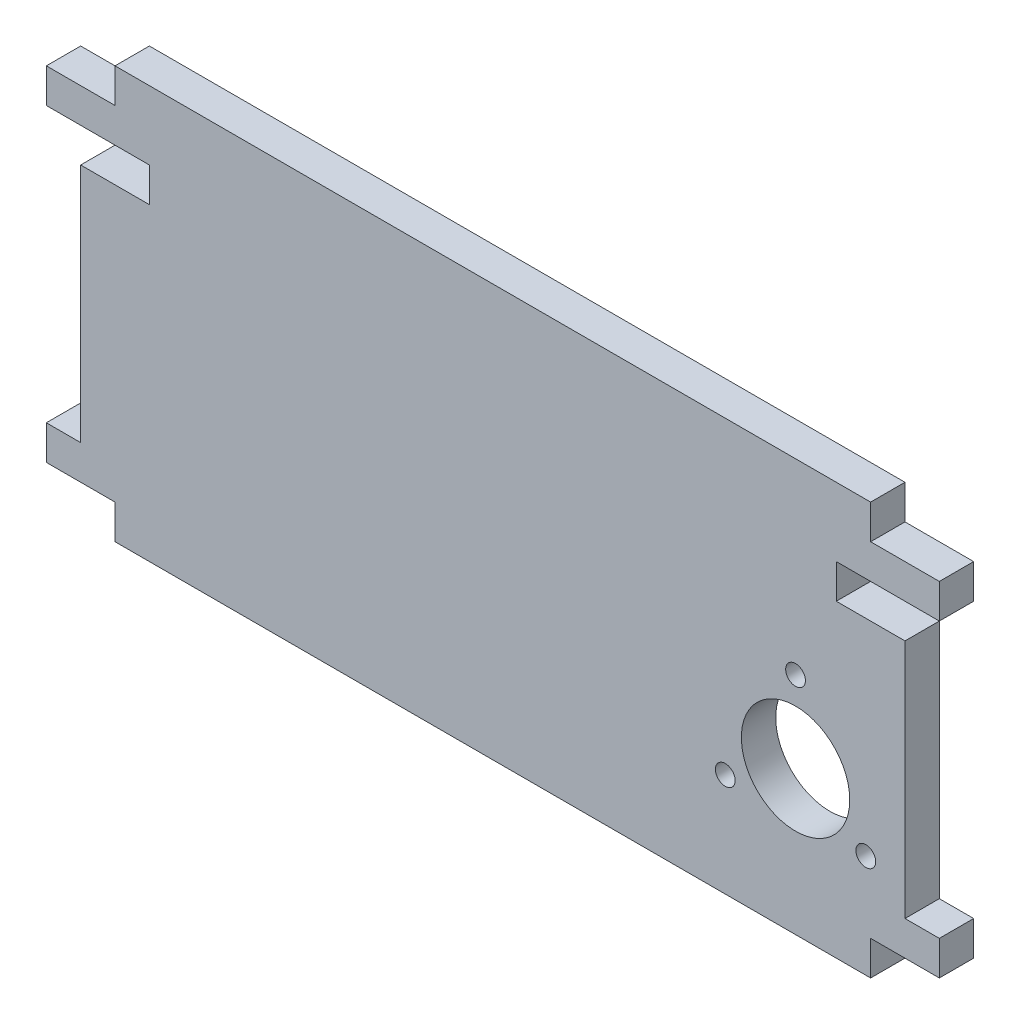
ISO-10303-21;
HEADER;
FILE_DESCRIPTION(('STEP AP214'),'2;1');
FILE_NAME('part.step','',(''),(''),'','','');
FILE_SCHEMA(('AUTOMOTIVE_DESIGN { 1 0 10303 214 1 1 1 1 }'));
ENDSEC;
DATA;
#1=APPLICATION_CONTEXT('core data for automotive mechanical design processes');
#2=APPLICATION_PROTOCOL_DEFINITION('international standard','automotive_design',2000,#1);
#3=PRODUCT_CONTEXT('',#1,'mechanical');
#4=PRODUCT('Part','Part','',(#3));
#5=PRODUCT_RELATED_PRODUCT_CATEGORY('part','',(#4));
#6=PRODUCT_DEFINITION_FORMATION('','',#4);
#7=PRODUCT_DEFINITION_CONTEXT('part definition',#1,'design');
#8=PRODUCT_DEFINITION('design','',#6,#7);
#9=PRODUCT_DEFINITION_SHAPE('','',#8);
#10=(LENGTH_UNIT() NAMED_UNIT(*) SI_UNIT(.MILLI.,.METRE.));
#11=(NAMED_UNIT(*) PLANE_ANGLE_UNIT() SI_UNIT($,.RADIAN.));
#12=(NAMED_UNIT(*) SI_UNIT($,.STERADIAN.) SOLID_ANGLE_UNIT());
#13=UNCERTAINTY_MEASURE_WITH_UNIT(LENGTH_MEASURE(1.E-05),#10,'distance_accuracy_value','');
#14=(GEOMETRIC_REPRESENTATION_CONTEXT(3) GLOBAL_UNCERTAINTY_ASSIGNED_CONTEXT((#13)) GLOBAL_UNIT_ASSIGNED_CONTEXT((#10,
#11,#12)) REPRESENTATION_CONTEXT('',''));
#15=CARTESIAN_POINT('',(0.,0.,0.));
#16=DIRECTION('',(0.,0.,1.));
#17=DIRECTION('',(1.,0.,0.));
#18=AXIS2_PLACEMENT_3D('',#15,#16,#17);
#19=CARTESIAN_POINT('',(0.,0.,0.));
#20=DIRECTION('',(0.,0.,1.));
#21=DIRECTION('',(1.,0.,0.));
#22=AXIS2_PLACEMENT_3D('',#19,#20,#21);
#23=PLANE('',#22);
#24=CARTESIAN_POINT('',(43.5592810567676,15.9061000000006,0.));
#25=DIRECTION('',(0.,0.,1.));
#26=DIRECTION('',(1.,0.,0.));
#27=AXIS2_PLACEMENT_3D('',#24,#25,#26);
#28=CIRCLE('',#27,1.8288);
#29=CARTESIAN_POINT('',(45.3880810567676,15.9061000000006,0.));
#30=VERTEX_POINT('',#29);
#31=EDGE_CURVE('E540',#30,#30,#28,.T.);
#32=ORIENTED_EDGE('',*,*,#31,.T.);
#33=EDGE_LOOP('',(#32));
#34=FACE_BOUND('',#33,.T.);
#35=CARTESIAN_POINT('',(17.5785189432344,15.9060999999994,0.));
#36=DIRECTION('',(0.,0.,1.));
#37=DIRECTION('',(1.,0.,0.));
#38=AXIS2_PLACEMENT_3D('',#35,#36,#37);
#39=CIRCLE('',#38,1.8288);
#40=CARTESIAN_POINT('',(19.4073189432344,15.9060999999994,0.));
#41=VERTEX_POINT('',#40);
#42=EDGE_CURVE('E536',#41,#41,#39,.T.);
#43=ORIENTED_EDGE('',*,*,#42,.T.);
#44=EDGE_LOOP('',(#43));
#45=FACE_BOUND('',#44,.T.);
#46=CARTESIAN_POINT('',(30.5689000000001,38.4061,0.));
#47=DIRECTION('',(0.,0.,1.));
#48=DIRECTION('',(1.,0.,0.));
#49=AXIS2_PLACEMENT_3D('',#46,#47,#48);
#50=CIRCLE('',#49,1.8288);
#51=CARTESIAN_POINT('',(32.3977000000001,38.4061,0.));
#52=VERTEX_POINT('',#51);
#53=EDGE_CURVE('E530',#52,#52,#50,.T.);
#54=ORIENTED_EDGE('',*,*,#53,.T.);
#55=EDGE_LOOP('',(#54));
#56=FACE_BOUND('',#55,.T.);
#57=CARTESIAN_POINT('',(30.5689000000001,23.4061,0.));
#58=DIRECTION('',(0.,0.,1.));
#59=DIRECTION('',(1.,0.,0.));
#60=AXIS2_PLACEMENT_3D('',#57,#58,#59);
#61=CIRCLE('',#60,10.0203);
#62=CARTESIAN_POINT('',(40.5892000000001,23.4061,0.));
#63=VERTEX_POINT('',#62);
#64=EDGE_CURVE('E225',#63,#63,#61,.T.);
#65=ORIENTED_EDGE('',*,*,#64,.T.);
#66=EDGE_LOOP('',(#65));
#67=FACE_BOUND('',#66,.T.);
#68=DIRECTION('',(0.,-1.,0.));
#69=VECTOR('',#68,1.);
#70=CARTESIAN_POINT('',(-101.6,60.325,0.));
#71=LINE('',#70,#69);
#72=CARTESIAN_POINT('',(-101.6,53.975,0.));
#73=VERTEX_POINT('',#72);
#74=CARTESIAN_POINT('',(-101.6,9.52500000000001,0.));
#75=VERTEX_POINT('',#74);
#76=EDGE_CURVE('E209',#73,#75,#71,.T.);
#77=ORIENTED_EDGE('',*,*,#76,.F.);
#78=DIRECTION('',(1.,0.,0.));
#79=VECTOR('',#78,1.);
#80=CARTESIAN_POINT('',(-107.95,53.975,0.));
#81=LINE('',#80,#79);
#82=CARTESIAN_POINT('',(-88.8999999999999,53.975,0.));
#83=VERTEX_POINT('',#82);
#84=EDGE_CURVE('E220',#73,#83,#81,.T.);
#85=ORIENTED_EDGE('',*,*,#84,.T.);
#86=DIRECTION('',(0.,1.,0.));
#87=VECTOR('',#86,1.);
#88=CARTESIAN_POINT('',(-88.8999999999999,53.975,0.));
#89=LINE('',#88,#87);
#90=CARTESIAN_POINT('',(-88.8999999999999,60.325,0.));
#91=VERTEX_POINT('',#90);
#92=EDGE_CURVE('E216',#83,#91,#89,.T.);
#93=ORIENTED_EDGE('',*,*,#92,.T.);
#94=DIRECTION('',(1.,0.,0.));
#95=VECTOR('',#94,1.);
#96=CARTESIAN_POINT('',(-107.95,60.325,0.));
#97=LINE('',#96,#95);
#98=CARTESIAN_POINT('',(-107.95,60.325,0.));
#99=VERTEX_POINT('',#98);
#100=EDGE_CURVE('E199',#99,#91,#97,.T.);
#101=ORIENTED_EDGE('',*,*,#100,.F.);
#102=DIRECTION('',(0.,-1.,0.));
#103=VECTOR('',#102,1.);
#104=CARTESIAN_POINT('',(-107.95,66.675,0.));
#105=LINE('',#104,#103);
#106=CARTESIAN_POINT('',(-107.95,66.675,0.));
#107=VERTEX_POINT('',#106);
#108=EDGE_CURVE('E210',#107,#99,#105,.T.);
#109=ORIENTED_EDGE('',*,*,#108,.F.);
#110=DIRECTION('',(-1.,0.,0.));
#111=VECTOR('',#110,1.);
#112=CARTESIAN_POINT('',(-95.2499999999999,66.675,0.));
#113=LINE('',#112,#111);
#114=CARTESIAN_POINT('',(-95.2499999999999,66.675,0.));
#115=VERTEX_POINT('',#114);
#116=EDGE_CURVE('E341',#115,#107,#113,.T.);
#117=ORIENTED_EDGE('',*,*,#116,.F.);
#118=DIRECTION('',(0.,-1.,0.));
#119=VECTOR('',#118,1.);
#120=CARTESIAN_POINT('',(-95.2499999999999,73.025,0.));
#121=LINE('',#120,#119);
#122=CARTESIAN_POINT('',(-95.2499999999999,73.025,0.));
#123=VERTEX_POINT('',#122);
#124=EDGE_CURVE('E338',#123,#115,#121,.T.);
#125=ORIENTED_EDGE('',*,*,#124,.F.);
#126=DIRECTION('',(-1.,0.,0.));
#127=VECTOR('',#126,1.);
#128=CARTESIAN_POINT('',(44.45,73.025,0.));
#129=LINE('',#128,#127);
#130=CARTESIAN_POINT('',(44.45,73.025,0.));
#131=VERTEX_POINT('',#130);
#132=EDGE_CURVE('E335',#131,#123,#129,.T.);
#133=ORIENTED_EDGE('',*,*,#132,.F.);
#134=DIRECTION('',(0.,1.,0.));
#135=VECTOR('',#134,1.);
#136=CARTESIAN_POINT('',(44.45,66.675,0.));
#137=LINE('',#136,#135);
#138=CARTESIAN_POINT('',(44.45,66.675,0.));
#139=VERTEX_POINT('',#138);
#140=EDGE_CURVE('E332',#139,#131,#137,.T.);
#141=ORIENTED_EDGE('',*,*,#140,.F.);
#142=DIRECTION('',(-1.,0.,0.));
#143=VECTOR('',#142,1.);
#144=CARTESIAN_POINT('',(57.15,66.675,0.));
#145=LINE('',#144,#143);
#146=CARTESIAN_POINT('',(57.15,66.675,0.));
#147=VERTEX_POINT('',#146);
#148=EDGE_CURVE('E329',#147,#139,#145,.T.);
#149=ORIENTED_EDGE('',*,*,#148,.F.);
#150=DIRECTION('',(0.,1.,0.));
#151=VECTOR('',#150,1.);
#152=CARTESIAN_POINT('',(57.15,60.325,0.));
#153=LINE('',#152,#151);
#154=CARTESIAN_POINT('',(57.15,60.325,0.));
#155=VERTEX_POINT('',#154);
#156=EDGE_CURVE('E326',#155,#147,#153,.T.);
#157=ORIENTED_EDGE('',*,*,#156,.F.);
#158=DIRECTION('',(1.,0.,0.));
#159=VECTOR('',#158,1.);
#160=CARTESIAN_POINT('',(50.8,60.325,0.));
#161=LINE('',#160,#159);
#162=CARTESIAN_POINT('',(38.1000000000001,60.325,0.));
#163=VERTEX_POINT('',#162);
#164=EDGE_CURVE('E323',#163,#155,#161,.T.);
#165=ORIENTED_EDGE('',*,*,#164,.F.);
#166=DIRECTION('',(0.,-1.,0.));
#167=VECTOR('',#166,1.);
#168=CARTESIAN_POINT('',(38.1000000000001,60.325,0.));
#169=LINE('',#168,#167);
#170=CARTESIAN_POINT('',(38.1000000000001,53.975,0.));
#171=VERTEX_POINT('',#170);
#172=EDGE_CURVE('E236',#163,#171,#169,.T.);
#173=ORIENTED_EDGE('',*,*,#172,.T.);
#174=DIRECTION('',(1.,0.,0.));
#175=VECTOR('',#174,1.);
#176=CARTESIAN_POINT('',(38.1000000000001,53.975,0.));
#177=LINE('',#176,#175);
#178=CARTESIAN_POINT('',(50.8,53.975,0.));
#179=VERTEX_POINT('',#178);
#180=EDGE_CURVE('E239',#171,#179,#177,.T.);
#181=ORIENTED_EDGE('',*,*,#180,.T.);
#182=DIRECTION('',(0.,1.,0.));
#183=VECTOR('',#182,1.);
#184=CARTESIAN_POINT('',(50.8,9.52500000000001,0.));
#185=LINE('',#184,#183);
#186=CARTESIAN_POINT('',(50.8,9.52500000000001,0.));
#187=VERTEX_POINT('',#186);
#188=EDGE_CURVE('E320',#187,#179,#185,.T.);
#189=ORIENTED_EDGE('',*,*,#188,.F.);
#190=DIRECTION('',(-1.,0.,0.));
#191=VECTOR('',#190,1.);
#192=CARTESIAN_POINT('',(57.15,9.52500000000001,0.));
#193=LINE('',#192,#191);
#194=CARTESIAN_POINT('',(57.15,9.52500000000001,0.));
#195=VERTEX_POINT('',#194);
#196=EDGE_CURVE('E317',#195,#187,#193,.T.);
#197=ORIENTED_EDGE('',*,*,#196,.F.);
#198=DIRECTION('',(0.,1.,0.));
#199=VECTOR('',#198,1.);
#200=CARTESIAN_POINT('',(57.15,3.175,0.));
#201=LINE('',#200,#199);
#202=CARTESIAN_POINT('',(57.15,3.175,0.));
#203=VERTEX_POINT('',#202);
#204=EDGE_CURVE('E314',#203,#195,#201,.T.);
#205=ORIENTED_EDGE('',*,*,#204,.F.);
#206=DIRECTION('',(1.,0.,0.));
#207=VECTOR('',#206,1.);
#208=CARTESIAN_POINT('',(44.45,3.175,0.));
#209=LINE('',#208,#207);
#210=CARTESIAN_POINT('',(44.45,3.175,0.));
#211=VERTEX_POINT('',#210);
#212=EDGE_CURVE('E311',#211,#203,#209,.T.);
#213=ORIENTED_EDGE('',*,*,#212,.F.);
#214=DIRECTION('',(0.,1.,0.));
#215=VECTOR('',#214,1.);
#216=CARTESIAN_POINT('',(44.45,-3.175,0.));
#217=LINE('',#216,#215);
#218=CARTESIAN_POINT('',(44.45,-3.175,0.));
#219=VERTEX_POINT('',#218);
#220=EDGE_CURVE('E308',#219,#211,#217,.T.);
#221=ORIENTED_EDGE('',*,*,#220,.F.);
#222=DIRECTION('',(1.,0.,0.));
#223=VECTOR('',#222,1.);
#224=CARTESIAN_POINT('',(-95.2499999999999,-3.175,0.));
#225=LINE('',#224,#223);
#226=CARTESIAN_POINT('',(-95.2499999999999,-3.175,0.));
#227=VERTEX_POINT('',#226);
#228=EDGE_CURVE('E305',#227,#219,#225,.T.);
#229=ORIENTED_EDGE('',*,*,#228,.F.);
#230=DIRECTION('',(0.,-1.,0.));
#231=VECTOR('',#230,1.);
#232=CARTESIAN_POINT('',(-95.2499999999999,3.175,0.));
#233=LINE('',#232,#231);
#234=CARTESIAN_POINT('',(-95.2499999999999,3.175,0.));
#235=VERTEX_POINT('',#234);
#236=EDGE_CURVE('E254',#235,#227,#233,.T.);
#237=ORIENTED_EDGE('',*,*,#236,.F.);
#238=DIRECTION('',(1.,0.,0.));
#239=VECTOR('',#238,1.);
#240=CARTESIAN_POINT('',(-107.95,3.175,0.));
#241=LINE('',#240,#239);
#242=CARTESIAN_POINT('',(-107.95,3.175,0.));
#243=VERTEX_POINT('',#242);
#244=EDGE_CURVE('E352',#243,#235,#241,.T.);
#245=ORIENTED_EDGE('',*,*,#244,.F.);
#246=DIRECTION('',(0.,-1.,0.));
#247=VECTOR('',#246,1.);
#248=CARTESIAN_POINT('',(-107.95,9.52500000000001,0.));
#249=LINE('',#248,#247);
#250=CARTESIAN_POINT('',(-107.95,9.52500000000001,0.));
#251=VERTEX_POINT('',#250);
#252=EDGE_CURVE('E349',#251,#243,#249,.T.);
#253=ORIENTED_EDGE('',*,*,#252,.F.);
#254=DIRECTION('',(-1.,0.,0.));
#255=VECTOR('',#254,1.);
#256=CARTESIAN_POINT('',(-101.6,9.52500000000001,0.));
#257=LINE('',#256,#255);
#258=EDGE_CURVE('E346',#75,#251,#257,.T.);
#259=ORIENTED_EDGE('',*,*,#258,.F.);
#260=EDGE_LOOP('',(#77,#85,#93,#101,#109,#117,#125,#133,#141,#149,#157,#165,#173,#181,#189,#197,
#205,#213,#221,#229,#237,#245,#253,#259));
#261=FACE_BOUND('',#260,.T.);
#262=ADVANCED_FACE('F33',(#34,#45,#56,#67,#261),#23,.F.);
#263=CARTESIAN_POINT('',(-107.95,3.175,188.18632750361));
#264=DIRECTION('',(0.,1.,0.));
#265=DIRECTION('',(0.,0.,1.));
#266=AXIS2_PLACEMENT_3D('',#263,#264,#265);
#267=PLANE('',#266);
#268=DIRECTION('',(0.,0.,-1.));
#269=VECTOR('',#268,1.);
#270=CARTESIAN_POINT('',(-95.2499999999999,3.175,188.18632750361));
#271=LINE('',#270,#269);
#272=CARTESIAN_POINT('',(-95.2499999999999,3.175,6.34999999999999));
#273=VERTEX_POINT('',#272);
#274=EDGE_CURVE('E355',#273,#235,#271,.T.);
#275=ORIENTED_EDGE('',*,*,#274,.F.);
#276=DIRECTION('',(-1.,0.,0.));
#277=VECTOR('',#276,1.);
#278=CARTESIAN_POINT('',(-107.95,3.175,6.34999999999999));
#279=LINE('',#278,#277);
#280=CARTESIAN_POINT('',(-107.95,3.175,6.34999999999999));
#281=VERTEX_POINT('',#280);
#282=EDGE_CURVE('E258',#273,#281,#279,.T.);
#283=ORIENTED_EDGE('',*,*,#282,.T.);
#284=DIRECTION('',(0.,0.,-1.));
#285=VECTOR('',#284,1.);
#286=CARTESIAN_POINT('',(-107.95,3.175,188.18632750361));
#287=LINE('',#286,#285);
#288=EDGE_CURVE('E357',#281,#243,#287,.T.);
#289=ORIENTED_EDGE('',*,*,#288,.T.);
#290=ORIENTED_EDGE('',*,*,#244,.T.);
#291=EDGE_LOOP('',(#275,#283,#289,#290));
#292=FACE_BOUND('',#291,.T.);
#293=ADVANCED_FACE('F393',(#292),#267,.F.);
#294=CARTESIAN_POINT('',(-107.95,9.52500000000001,188.18632750361));
#295=DIRECTION('',(1.,0.,0.));
#296=DIRECTION('',(0.,0.,-1.));
#297=AXIS2_PLACEMENT_3D('',#294,#295,#296);
#298=PLANE('',#297);
#299=ORIENTED_EDGE('',*,*,#288,.F.);
#300=DIRECTION('',(0.,1.,0.));
#301=VECTOR('',#300,1.);
#302=CARTESIAN_POINT('',(-107.95,9.52500000000001,6.34999999999999));
#303=LINE('',#302,#301);
#304=CARTESIAN_POINT('',(-107.95,9.52500000000001,6.34999999999999));
#305=VERTEX_POINT('',#304);
#306=EDGE_CURVE('E255',#281,#305,#303,.T.);
#307=ORIENTED_EDGE('',*,*,#306,.T.);
#308=DIRECTION('',(0.,0.,-1.));
#309=VECTOR('',#308,1.);
#310=CARTESIAN_POINT('',(-107.95,9.52500000000001,188.18632750361));
#311=LINE('',#310,#309);
#312=EDGE_CURVE('E359',#305,#251,#311,.T.);
#313=ORIENTED_EDGE('',*,*,#312,.T.);
#314=ORIENTED_EDGE('',*,*,#252,.T.);
#315=EDGE_LOOP('',(#299,#307,#313,#314));
#316=FACE_BOUND('',#315,.T.);
#317=ADVANCED_FACE('F475',(#316),#298,.F.);
#318=CARTESIAN_POINT('',(-101.6,9.52500000000001,188.18632750361));
#319=DIRECTION('',(0.,-1.,0.));
#320=DIRECTION('',(0.,0.,-1.));
#321=AXIS2_PLACEMENT_3D('',#318,#319,#320);
#322=PLANE('',#321);
#323=ORIENTED_EDGE('',*,*,#312,.F.);
#324=DIRECTION('',(1.,0.,0.));
#325=VECTOR('',#324,1.);
#326=CARTESIAN_POINT('',(-101.6,9.52500000000001,6.34999999999999));
#327=LINE('',#326,#325);
#328=CARTESIAN_POINT('',(-101.6,9.52500000000001,6.34999999999999));
#329=VERTEX_POINT('',#328);
#330=EDGE_CURVE('E56',#305,#329,#327,.T.);
#331=ORIENTED_EDGE('',*,*,#330,.T.);
#332=DIRECTION('',(0.,0.,-1.));
#333=VECTOR('',#332,1.);
#334=CARTESIAN_POINT('',(-101.6,9.52500000000001,188.18632750361));
#335=LINE('',#334,#333);
#336=EDGE_CURVE('E361',#329,#75,#335,.T.);
#337=ORIENTED_EDGE('',*,*,#336,.T.);
#338=ORIENTED_EDGE('',*,*,#258,.T.);
#339=EDGE_LOOP('',(#323,#331,#337,#338));
#340=FACE_BOUND('',#339,.T.);
#341=ADVANCED_FACE('F484',(#340),#322,.F.);
#342=CARTESIAN_POINT('',(-101.6,60.325,188.18632750361));
#343=DIRECTION('',(1.,0.,0.));
#344=DIRECTION('',(0.,0.,-1.));
#345=AXIS2_PLACEMENT_3D('',#342,#343,#344);
#346=PLANE('',#345);
#347=DIRECTION('',(0.,1.,0.));
#348=VECTOR('',#347,1.);
#349=CARTESIAN_POINT('',(-101.6,60.325,6.34999999999999));
#350=LINE('',#349,#348);
#351=CARTESIAN_POINT('',(-101.6,53.975,6.35));
#352=VERTEX_POINT('',#351);
#353=EDGE_CURVE('E260',#329,#352,#350,.T.);
#354=ORIENTED_EDGE('',*,*,#353,.T.);
#355=DIRECTION('',(0.,0.,-1.));
#356=VECTOR('',#355,1.);
#357=CARTESIAN_POINT('',(-101.6,53.975,188.18632750361));
#358=LINE('',#357,#356);
#359=EDGE_CURVE('E231',#352,#73,#358,.T.);
#360=ORIENTED_EDGE('',*,*,#359,.T.);
#361=ORIENTED_EDGE('',*,*,#76,.T.);
#362=ORIENTED_EDGE('',*,*,#336,.F.);
#363=EDGE_LOOP('',(#354,#360,#361,#362));
#364=FACE_BOUND('',#363,.T.);
#365=ADVANCED_FACE('F467',(#364),#346,.F.);
#366=CARTESIAN_POINT('',(-107.95,60.325,188.18632750361));
#367=DIRECTION('',(0.,1.,0.));
#368=DIRECTION('',(0.,0.,1.));
#369=AXIS2_PLACEMENT_3D('',#366,#367,#368);
#370=PLANE('',#369);
#371=ORIENTED_EDGE('',*,*,#100,.T.);
#372=DIRECTION('',(0.,0.,1.));
#373=VECTOR('',#372,1.);
#374=CARTESIAN_POINT('',(-88.8999999999999,60.325,0.));
#375=LINE('',#374,#373);
#376=CARTESIAN_POINT('',(-88.8999999999999,60.325,6.35));
#377=VERTEX_POINT('',#376);
#378=EDGE_CURVE('E202',#91,#377,#375,.T.);
#379=ORIENTED_EDGE('',*,*,#378,.T.);
#380=DIRECTION('',(-1.,0.,0.));
#381=VECTOR('',#380,1.);
#382=CARTESIAN_POINT('',(-107.95,60.325,6.34999999999999));
#383=LINE('',#382,#381);
#384=CARTESIAN_POINT('',(-107.95,60.325,6.34999999999999));
#385=VERTEX_POINT('',#384);
#386=EDGE_CURVE('E48',#377,#385,#383,.T.);
#387=ORIENTED_EDGE('',*,*,#386,.T.);
#388=DIRECTION('',(0.,0.,-1.));
#389=VECTOR('',#388,1.);
#390=CARTESIAN_POINT('',(-107.95,60.325,188.18632750361));
#391=LINE('',#390,#389);
#392=EDGE_CURVE('E204',#385,#99,#391,.T.);
#393=ORIENTED_EDGE('',*,*,#392,.T.);
#394=EDGE_LOOP('',(#371,#379,#387,#393));
#395=FACE_BOUND('',#394,.T.);
#396=ADVANCED_FACE('F201',(#395),#370,.F.);
#397=CARTESIAN_POINT('',(-107.95,66.675,188.18632750361));
#398=DIRECTION('',(1.,0.,0.));
#399=DIRECTION('',(0.,0.,-1.));
#400=AXIS2_PLACEMENT_3D('',#397,#398,#399);
#401=PLANE('',#400);
#402=ORIENTED_EDGE('',*,*,#392,.F.);
#403=DIRECTION('',(0.,1.,0.));
#404=VECTOR('',#403,1.);
#405=CARTESIAN_POINT('',(-107.95,66.675,6.34999999999999));
#406=LINE('',#405,#404);
#407=CARTESIAN_POINT('',(-107.95,66.675,6.34999999999999));
#408=VERTEX_POINT('',#407);
#409=EDGE_CURVE('E264',#385,#408,#406,.T.);
#410=ORIENTED_EDGE('',*,*,#409,.T.);
#411=DIRECTION('',(0.,0.,-1.));
#412=VECTOR('',#411,1.);
#413=CARTESIAN_POINT('',(-107.95,66.675,188.18632750361));
#414=LINE('',#413,#412);
#415=EDGE_CURVE('E365',#408,#107,#414,.T.);
#416=ORIENTED_EDGE('',*,*,#415,.T.);
#417=ORIENTED_EDGE('',*,*,#108,.T.);
#418=EDGE_LOOP('',(#402,#410,#416,#417));
#419=FACE_BOUND('',#418,.T.);
#420=ADVANCED_FACE('F459',(#419),#401,.F.);
#421=CARTESIAN_POINT('',(-95.2499999999999,66.675,188.18632750361));
#422=DIRECTION('',(0.,-1.,0.));
#423=DIRECTION('',(0.,0.,-1.));
#424=AXIS2_PLACEMENT_3D('',#421,#422,#423);
#425=PLANE('',#424);
#426=ORIENTED_EDGE('',*,*,#415,.F.);
#427=DIRECTION('',(1.,0.,0.));
#428=VECTOR('',#427,1.);
#429=CARTESIAN_POINT('',(-95.2499999999999,66.675,6.34999999999999));
#430=LINE('',#429,#428);
#431=CARTESIAN_POINT('',(-95.2499999999999,66.675,6.34999999999999));
#432=VERTEX_POINT('',#431);
#433=EDGE_CURVE('E267',#408,#432,#430,.T.);
#434=ORIENTED_EDGE('',*,*,#433,.T.);
#435=DIRECTION('',(0.,0.,-1.));
#436=VECTOR('',#435,1.);
#437=CARTESIAN_POINT('',(-95.2499999999999,66.675,188.18632750361));
#438=LINE('',#437,#436);
#439=EDGE_CURVE('E367',#432,#115,#438,.T.);
#440=ORIENTED_EDGE('',*,*,#439,.T.);
#441=ORIENTED_EDGE('',*,*,#116,.T.);
#442=EDGE_LOOP('',(#426,#434,#440,#441));
#443=FACE_BOUND('',#442,.T.);
#444=ADVANCED_FACE('F456',(#443),#425,.F.);
#445=CARTESIAN_POINT('',(-95.2499999999999,73.025,188.18632750361));
#446=DIRECTION('',(1.,0.,0.));
#447=DIRECTION('',(0.,0.,-1.));
#448=AXIS2_PLACEMENT_3D('',#445,#446,#447);
#449=PLANE('',#448);
#450=ORIENTED_EDGE('',*,*,#439,.F.);
#451=DIRECTION('',(0.,1.,0.));
#452=VECTOR('',#451,1.);
#453=CARTESIAN_POINT('',(-95.2499999999999,73.025,6.34999999999999));
#454=LINE('',#453,#452);
#455=CARTESIAN_POINT('',(-95.2499999999999,73.025,6.34999999999999));
#456=VERTEX_POINT('',#455);
#457=EDGE_CURVE('E270',#432,#456,#454,.T.);
#458=ORIENTED_EDGE('',*,*,#457,.T.);
#459=DIRECTION('',(0.,0.,-1.));
#460=VECTOR('',#459,1.);
#461=CARTESIAN_POINT('',(-95.2499999999999,73.025,188.18632750361));
#462=LINE('',#461,#460);
#463=EDGE_CURVE('E369',#456,#123,#462,.T.);
#464=ORIENTED_EDGE('',*,*,#463,.T.);
#465=ORIENTED_EDGE('',*,*,#124,.T.);
#466=EDGE_LOOP('',(#450,#458,#464,#465));
#467=FACE_BOUND('',#466,.T.);
#468=ADVANCED_FACE('F453',(#467),#449,.F.);
#469=CARTESIAN_POINT('',(44.45,73.025,188.18632750361));
#470=DIRECTION('',(0.,-1.,0.));
#471=DIRECTION('',(0.,0.,-1.));
#472=AXIS2_PLACEMENT_3D('',#469,#470,#471);
#473=PLANE('',#472);
#474=ORIENTED_EDGE('',*,*,#463,.F.);
#475=DIRECTION('',(1.,0.,0.));
#476=VECTOR('',#475,1.);
#477=CARTESIAN_POINT('',(44.45,73.025,6.34999999999999));
#478=LINE('',#477,#476);
#479=CARTESIAN_POINT('',(44.45,73.025,6.34999999999999));
#480=VERTEX_POINT('',#479);
#481=EDGE_CURVE('E273',#456,#480,#478,.T.);
#482=ORIENTED_EDGE('',*,*,#481,.T.);
#483=DIRECTION('',(0.,0.,-1.));
#484=VECTOR('',#483,1.);
#485=CARTESIAN_POINT('',(44.45,73.025,188.18632750361));
#486=LINE('',#485,#484);
#487=EDGE_CURVE('E371',#480,#131,#486,.T.);
#488=ORIENTED_EDGE('',*,*,#487,.T.);
#489=ORIENTED_EDGE('',*,*,#132,.T.);
#490=EDGE_LOOP('',(#474,#482,#488,#489));
#491=FACE_BOUND('',#490,.T.);
#492=ADVANCED_FACE('F449',(#491),#473,.F.);
#493=CARTESIAN_POINT('',(44.45,66.675,188.18632750361));
#494=DIRECTION('',(-1.,0.,0.));
#495=DIRECTION('',(0.,0.,1.));
#496=AXIS2_PLACEMENT_3D('',#493,#494,#495);
#497=PLANE('',#496);
#498=ORIENTED_EDGE('',*,*,#487,.F.);
#499=DIRECTION('',(0.,-1.,0.));
#500=VECTOR('',#499,1.);
#501=CARTESIAN_POINT('',(44.45,66.675,6.34999999999999));
#502=LINE('',#501,#500);
#503=CARTESIAN_POINT('',(44.45,66.675,6.34999999999999));
#504=VERTEX_POINT('',#503);
#505=EDGE_CURVE('E276',#480,#504,#502,.T.);
#506=ORIENTED_EDGE('',*,*,#505,.T.);
#507=DIRECTION('',(0.,0.,-1.));
#508=VECTOR('',#507,1.);
#509=CARTESIAN_POINT('',(44.45,66.675,188.18632750361));
#510=LINE('',#509,#508);
#511=EDGE_CURVE('E373',#504,#139,#510,.T.);
#512=ORIENTED_EDGE('',*,*,#511,.T.);
#513=ORIENTED_EDGE('',*,*,#140,.T.);
#514=EDGE_LOOP('',(#498,#506,#512,#513));
#515=FACE_BOUND('',#514,.T.);
#516=ADVANCED_FACE('F445',(#515),#497,.F.);
#517=CARTESIAN_POINT('',(57.15,66.675,188.18632750361));
#518=DIRECTION('',(0.,-1.,0.));
#519=DIRECTION('',(0.,0.,-1.));
#520=AXIS2_PLACEMENT_3D('',#517,#518,#519);
#521=PLANE('',#520);
#522=ORIENTED_EDGE('',*,*,#511,.F.);
#523=DIRECTION('',(1.,0.,0.));
#524=VECTOR('',#523,1.);
#525=CARTESIAN_POINT('',(57.15,66.675,6.34999999999999));
#526=LINE('',#525,#524);
#527=CARTESIAN_POINT('',(57.15,66.675,6.34999999999999));
#528=VERTEX_POINT('',#527);
#529=EDGE_CURVE('E279',#504,#528,#526,.T.);
#530=ORIENTED_EDGE('',*,*,#529,.T.);
#531=DIRECTION('',(0.,0.,-1.));
#532=VECTOR('',#531,1.);
#533=CARTESIAN_POINT('',(57.15,66.675,188.18632750361));
#534=LINE('',#533,#532);
#535=EDGE_CURVE('E375',#528,#147,#534,.T.);
#536=ORIENTED_EDGE('',*,*,#535,.T.);
#537=ORIENTED_EDGE('',*,*,#148,.T.);
#538=EDGE_LOOP('',(#522,#530,#536,#537));
#539=FACE_BOUND('',#538,.T.);
#540=ADVANCED_FACE('F441',(#539),#521,.F.);
#541=CARTESIAN_POINT('',(57.15,60.325,188.18632750361));
#542=DIRECTION('',(-1.,0.,0.));
#543=DIRECTION('',(0.,0.,1.));
#544=AXIS2_PLACEMENT_3D('',#541,#542,#543);
#545=PLANE('',#544);
#546=ORIENTED_EDGE('',*,*,#535,.F.);
#547=DIRECTION('',(0.,-1.,0.));
#548=VECTOR('',#547,1.);
#549=CARTESIAN_POINT('',(57.15,60.325,6.34999999999999));
#550=LINE('',#549,#548);
#551=CARTESIAN_POINT('',(57.15,60.325,6.34999999999999));
#552=VERTEX_POINT('',#551);
#553=EDGE_CURVE('E282',#528,#552,#550,.T.);
#554=ORIENTED_EDGE('',*,*,#553,.T.);
#555=DIRECTION('',(0.,0.,-1.));
#556=VECTOR('',#555,1.);
#557=CARTESIAN_POINT('',(57.15,60.325,188.18632750361));
#558=LINE('',#557,#556);
#559=EDGE_CURVE('E377',#552,#155,#558,.T.);
#560=ORIENTED_EDGE('',*,*,#559,.T.);
#561=ORIENTED_EDGE('',*,*,#156,.T.);
#562=EDGE_LOOP('',(#546,#554,#560,#561));
#563=FACE_BOUND('',#562,.T.);
#564=ADVANCED_FACE('F437',(#563),#545,.F.);
#565=CARTESIAN_POINT('',(50.8,60.325,188.18632750361));
#566=DIRECTION('',(0.,1.,0.));
#567=DIRECTION('',(0.,0.,1.));
#568=AXIS2_PLACEMENT_3D('',#565,#566,#567);
#569=PLANE('',#568);
#570=ORIENTED_EDGE('',*,*,#559,.F.);
#571=DIRECTION('',(-1.,0.,0.));
#572=VECTOR('',#571,1.);
#573=CARTESIAN_POINT('',(50.8,60.325,6.34999999999999));
#574=LINE('',#573,#572);
#575=CARTESIAN_POINT('',(38.1000000000001,60.325,6.35));
#576=VERTEX_POINT('',#575);
#577=EDGE_CURVE('E285',#552,#576,#574,.T.);
#578=ORIENTED_EDGE('',*,*,#577,.T.);
#579=DIRECTION('',(0.,0.,1.));
#580=VECTOR('',#579,1.);
#581=CARTESIAN_POINT('',(38.1000000000001,60.325,0.));
#582=LINE('',#581,#580);
#583=EDGE_CURVE('E243',#163,#576,#582,.T.);
#584=ORIENTED_EDGE('',*,*,#583,.F.);
#585=ORIENTED_EDGE('',*,*,#164,.T.);
#586=EDGE_LOOP('',(#570,#578,#584,#585));
#587=FACE_BOUND('',#586,.T.);
#588=ADVANCED_FACE('F435',(#587),#569,.F.);
#589=CARTESIAN_POINT('',(50.8,9.52500000000001,188.18632750361));
#590=DIRECTION('',(-1.,0.,0.));
#591=DIRECTION('',(0.,0.,1.));
#592=AXIS2_PLACEMENT_3D('',#589,#590,#591);
#593=PLANE('',#592);
#594=ORIENTED_EDGE('',*,*,#188,.T.);
#595=DIRECTION('',(0.,0.,1.));
#596=VECTOR('',#595,1.);
#597=CARTESIAN_POINT('',(50.8,53.975,188.18632750361));
#598=LINE('',#597,#596);
#599=CARTESIAN_POINT('',(50.8,53.975,6.35));
#600=VERTEX_POINT('',#599);
#601=EDGE_CURVE('E249',#179,#600,#598,.T.);
#602=ORIENTED_EDGE('',*,*,#601,.T.);
#603=DIRECTION('',(0.,-1.,0.));
#604=VECTOR('',#603,1.);
#605=CARTESIAN_POINT('',(50.8,9.52500000000001,6.34999999999999));
#606=LINE('',#605,#604);
#607=CARTESIAN_POINT('',(50.8,9.52500000000001,6.34999999999999));
#608=VERTEX_POINT('',#607);
#609=EDGE_CURVE('E287',#600,#608,#606,.T.);
#610=ORIENTED_EDGE('',*,*,#609,.T.);
#611=DIRECTION('',(0.,0.,-1.));
#612=VECTOR('',#611,1.);
#613=CARTESIAN_POINT('',(50.8,9.52500000000001,188.18632750361));
#614=LINE('',#613,#612);
#615=EDGE_CURVE('E379',#608,#187,#614,.T.);
#616=ORIENTED_EDGE('',*,*,#615,.T.);
#617=EDGE_LOOP('',(#594,#602,#610,#616));
#618=FACE_BOUND('',#617,.T.);
#619=ADVANCED_FACE('F422',(#618),#593,.F.);
#620=CARTESIAN_POINT('',(57.15,9.52500000000001,188.18632750361));
#621=DIRECTION('',(0.,-1.,0.));
#622=DIRECTION('',(0.,0.,-1.));
#623=AXIS2_PLACEMENT_3D('',#620,#621,#622);
#624=PLANE('',#623);
#625=ORIENTED_EDGE('',*,*,#615,.F.);
#626=DIRECTION('',(1.,0.,0.));
#627=VECTOR('',#626,1.);
#628=CARTESIAN_POINT('',(57.15,9.52500000000001,6.34999999999999));
#629=LINE('',#628,#627);
#630=CARTESIAN_POINT('',(57.15,9.52500000000001,6.34999999999999));
#631=VERTEX_POINT('',#630);
#632=EDGE_CURVE('E289',#608,#631,#629,.T.);
#633=ORIENTED_EDGE('',*,*,#632,.T.);
#634=DIRECTION('',(0.,0.,-1.));
#635=VECTOR('',#634,1.);
#636=CARTESIAN_POINT('',(57.15,9.52500000000001,188.18632750361));
#637=LINE('',#636,#635);
#638=EDGE_CURVE('E381',#631,#195,#637,.T.);
#639=ORIENTED_EDGE('',*,*,#638,.T.);
#640=ORIENTED_EDGE('',*,*,#196,.T.);
#641=EDGE_LOOP('',(#625,#633,#639,#640));
#642=FACE_BOUND('',#641,.T.);
#643=ADVANCED_FACE('F417',(#642),#624,.F.);
#644=CARTESIAN_POINT('',(57.15,3.175,188.18632750361));
#645=DIRECTION('',(-1.,0.,0.));
#646=DIRECTION('',(0.,0.,1.));
#647=AXIS2_PLACEMENT_3D('',#644,#645,#646);
#648=PLANE('',#647);
#649=ORIENTED_EDGE('',*,*,#638,.F.);
#650=DIRECTION('',(0.,-1.,0.));
#651=VECTOR('',#650,1.);
#652=CARTESIAN_POINT('',(57.15,3.175,6.34999999999999));
#653=LINE('',#652,#651);
#654=CARTESIAN_POINT('',(57.15,3.175,6.34999999999999));
#655=VERTEX_POINT('',#654);
#656=EDGE_CURVE('E292',#631,#655,#653,.T.);
#657=ORIENTED_EDGE('',*,*,#656,.T.);
#658=DIRECTION('',(0.,0.,-1.));
#659=VECTOR('',#658,1.);
#660=CARTESIAN_POINT('',(57.15,3.175,188.18632750361));
#661=LINE('',#660,#659);
#662=EDGE_CURVE('E383',#655,#203,#661,.T.);
#663=ORIENTED_EDGE('',*,*,#662,.T.);
#664=ORIENTED_EDGE('',*,*,#204,.T.);
#665=EDGE_LOOP('',(#649,#657,#663,#664));
#666=FACE_BOUND('',#665,.T.);
#667=ADVANCED_FACE('F413',(#666),#648,.F.);
#668=CARTESIAN_POINT('',(44.45,3.175,188.18632750361));
#669=DIRECTION('',(0.,1.,0.));
#670=DIRECTION('',(0.,0.,1.));
#671=AXIS2_PLACEMENT_3D('',#668,#669,#670);
#672=PLANE('',#671);
#673=ORIENTED_EDGE('',*,*,#662,.F.);
#674=DIRECTION('',(-1.,0.,0.));
#675=VECTOR('',#674,1.);
#676=CARTESIAN_POINT('',(44.45,3.175,6.34999999999999));
#677=LINE('',#676,#675);
#678=CARTESIAN_POINT('',(44.45,3.175,6.34999999999999));
#679=VERTEX_POINT('',#678);
#680=EDGE_CURVE('E295',#655,#679,#677,.T.);
#681=ORIENTED_EDGE('',*,*,#680,.T.);
#682=DIRECTION('',(0.,0.,-1.));
#683=VECTOR('',#682,1.);
#684=CARTESIAN_POINT('',(44.45,3.175,188.18632750361));
#685=LINE('',#684,#683);
#686=EDGE_CURVE('E385',#679,#211,#685,.T.);
#687=ORIENTED_EDGE('',*,*,#686,.T.);
#688=ORIENTED_EDGE('',*,*,#212,.T.);
#689=EDGE_LOOP('',(#673,#681,#687,#688));
#690=FACE_BOUND('',#689,.T.);
#691=ADVANCED_FACE('F409',(#690),#672,.F.);
#692=CARTESIAN_POINT('',(44.45,-3.175,188.18632750361));
#693=DIRECTION('',(-1.,0.,0.));
#694=DIRECTION('',(0.,0.,1.));
#695=AXIS2_PLACEMENT_3D('',#692,#693,#694);
#696=PLANE('',#695);
#697=ORIENTED_EDGE('',*,*,#686,.F.);
#698=DIRECTION('',(0.,-1.,0.));
#699=VECTOR('',#698,1.);
#700=CARTESIAN_POINT('',(44.45,-3.175,6.34999999999999));
#701=LINE('',#700,#699);
#702=CARTESIAN_POINT('',(44.45,-3.175,6.34999999999999));
#703=VERTEX_POINT('',#702);
#704=EDGE_CURVE('E298',#679,#703,#701,.T.);
#705=ORIENTED_EDGE('',*,*,#704,.T.);
#706=DIRECTION('',(0.,0.,-1.));
#707=VECTOR('',#706,1.);
#708=CARTESIAN_POINT('',(44.45,-3.175,188.18632750361));
#709=LINE('',#708,#707);
#710=EDGE_CURVE('E387',#703,#219,#709,.T.);
#711=ORIENTED_EDGE('',*,*,#710,.T.);
#712=ORIENTED_EDGE('',*,*,#220,.T.);
#713=EDGE_LOOP('',(#697,#705,#711,#712));
#714=FACE_BOUND('',#713,.T.);
#715=ADVANCED_FACE('F404',(#714),#696,.F.);
#716=CARTESIAN_POINT('',(-95.2499999999999,-3.175,188.18632750361));
#717=DIRECTION('',(0.,1.,0.));
#718=DIRECTION('',(0.,0.,1.));
#719=AXIS2_PLACEMENT_3D('',#716,#717,#718);
#720=PLANE('',#719);
#721=ORIENTED_EDGE('',*,*,#710,.F.);
#722=DIRECTION('',(-1.,0.,0.));
#723=VECTOR('',#722,1.);
#724=CARTESIAN_POINT('',(-95.2499999999999,-3.175,6.34999999999999));
#725=LINE('',#724,#723);
#726=CARTESIAN_POINT('',(-95.2499999999999,-3.175,6.34999999999999));
#727=VERTEX_POINT('',#726);
#728=EDGE_CURVE('E102',#703,#727,#725,.T.);
#729=ORIENTED_EDGE('',*,*,#728,.T.);
#730=DIRECTION('',(0.,0.,-1.));
#731=VECTOR('',#730,1.);
#732=CARTESIAN_POINT('',(-95.2499999999999,-3.175,188.18632750361));
#733=LINE('',#732,#731);
#734=EDGE_CURVE('E389',#727,#227,#733,.T.);
#735=ORIENTED_EDGE('',*,*,#734,.T.);
#736=ORIENTED_EDGE('',*,*,#228,.T.);
#737=EDGE_LOOP('',(#721,#729,#735,#736));
#738=FACE_BOUND('',#737,.T.);
#739=ADVANCED_FACE('F400',(#738),#720,.F.);
#740=CARTESIAN_POINT('',(-95.2499999999999,3.175,188.18632750361));
#741=DIRECTION('',(1.,0.,0.));
#742=DIRECTION('',(0.,0.,-1.));
#743=AXIS2_PLACEMENT_3D('',#740,#741,#742);
#744=PLANE('',#743);
#745=ORIENTED_EDGE('',*,*,#734,.F.);
#746=DIRECTION('',(0.,1.,0.));
#747=VECTOR('',#746,1.);
#748=CARTESIAN_POINT('',(-95.2499999999999,3.175,6.34999999999999));
#749=LINE('',#748,#747);
#750=EDGE_CURVE('E41',#727,#273,#749,.T.);
#751=ORIENTED_EDGE('',*,*,#750,.T.);
#752=ORIENTED_EDGE('',*,*,#274,.T.);
#753=ORIENTED_EDGE('',*,*,#236,.T.);
#754=EDGE_LOOP('',(#745,#751,#752,#753));
#755=FACE_BOUND('',#754,.T.);
#756=ADVANCED_FACE('F35',(#755),#744,.F.);
#757=CARTESIAN_POINT('',(101.6,3.175,6.35));
#758=DIRECTION('',(0.,0.,-1.));
#759=DIRECTION('',(-1.,0.,0.));
#760=AXIS2_PLACEMENT_3D('',#757,#758,#759);
#761=PLANE('',#760);
#762=CARTESIAN_POINT('',(43.5592810567676,15.9061000000006,6.35));
#763=DIRECTION('',(0.,0.,1.));
#764=DIRECTION('',(1.,0.,0.));
#765=AXIS2_PLACEMENT_3D('',#762,#763,#764);
#766=CIRCLE('',#765,1.8288);
#767=CARTESIAN_POINT('',(45.3880810567676,15.9061000000006,6.35));
#768=VERTEX_POINT('',#767);
#769=EDGE_CURVE('E518',#768,#768,#766,.T.);
#770=ORIENTED_EDGE('',*,*,#769,.F.);
#771=EDGE_LOOP('',(#770));
#772=FACE_BOUND('',#771,.T.);
#773=CARTESIAN_POINT('',(17.5785189432344,15.9060999999994,6.35));
#774=DIRECTION('',(0.,0.,1.));
#775=DIRECTION('',(1.,0.,0.));
#776=AXIS2_PLACEMENT_3D('',#773,#774,#775);
#777=CIRCLE('',#776,1.8288);
#778=CARTESIAN_POINT('',(19.4073189432344,15.9060999999994,6.35));
#779=VERTEX_POINT('',#778);
#780=EDGE_CURVE('E522',#779,#779,#777,.T.);
#781=ORIENTED_EDGE('',*,*,#780,.F.);
#782=EDGE_LOOP('',(#781));
#783=FACE_BOUND('',#782,.T.);
#784=CARTESIAN_POINT('',(30.5689000000001,38.4061,6.35));
#785=DIRECTION('',(0.,0.,1.));
#786=DIRECTION('',(1.,0.,0.));
#787=AXIS2_PLACEMENT_3D('',#784,#785,#786);
#788=CIRCLE('',#787,1.8288);
#789=CARTESIAN_POINT('',(32.3977000000001,38.4061,6.35));
#790=VERTEX_POINT('',#789);
#791=EDGE_CURVE('E526',#790,#790,#788,.T.);
#792=ORIENTED_EDGE('',*,*,#791,.F.);
#793=EDGE_LOOP('',(#792));
#794=FACE_BOUND('',#793,.T.);
#795=CARTESIAN_POINT('',(30.5689000000001,23.4061,6.35));
#796=DIRECTION('',(0.,0.,1.));
#797=DIRECTION('',(1.,0.,0.));
#798=AXIS2_PLACEMENT_3D('',#795,#796,#797);
#799=CIRCLE('',#798,10.0203);
#800=CARTESIAN_POINT('',(40.5892000000001,23.4061,6.35));
#801=VERTEX_POINT('',#800);
#802=EDGE_CURVE('E228',#801,#801,#799,.T.);
#803=ORIENTED_EDGE('',*,*,#802,.F.);
#804=EDGE_LOOP('',(#803));
#805=FACE_BOUND('',#804,.T.);
#806=DIRECTION('',(0.,1.,0.));
#807=VECTOR('',#806,1.);
#808=CARTESIAN_POINT('',(-88.8999999999999,53.975,6.35));
#809=LINE('',#808,#807);
#810=CARTESIAN_POINT('',(-88.8999999999999,53.975,6.35));
#811=VERTEX_POINT('',#810);
#812=EDGE_CURVE('E218',#811,#377,#809,.T.);
#813=ORIENTED_EDGE('',*,*,#812,.F.);
#814=DIRECTION('',(-1.,0.,0.));
#815=VECTOR('',#814,1.);
#816=CARTESIAN_POINT('',(101.6,53.975,6.35));
#817=LINE('',#816,#815);
#818=EDGE_CURVE('E11',#811,#352,#817,.T.);
#819=ORIENTED_EDGE('',*,*,#818,.T.);
#820=ORIENTED_EDGE('',*,*,#353,.F.);
#821=ORIENTED_EDGE('',*,*,#330,.F.);
#822=ORIENTED_EDGE('',*,*,#306,.F.);
#823=ORIENTED_EDGE('',*,*,#282,.F.);
#824=ORIENTED_EDGE('',*,*,#750,.F.);
#825=ORIENTED_EDGE('',*,*,#728,.F.);
#826=ORIENTED_EDGE('',*,*,#704,.F.);
#827=ORIENTED_EDGE('',*,*,#680,.F.);
#828=ORIENTED_EDGE('',*,*,#656,.F.);
#829=ORIENTED_EDGE('',*,*,#632,.F.);
#830=ORIENTED_EDGE('',*,*,#609,.F.);
#831=DIRECTION('',(1.,0.,0.));
#832=VECTOR('',#831,1.);
#833=CARTESIAN_POINT('',(38.1000000000001,53.975,6.35));
#834=LINE('',#833,#832);
#835=CARTESIAN_POINT('',(38.1000000000001,53.975,6.35));
#836=VERTEX_POINT('',#835);
#837=EDGE_CURVE('E240',#836,#600,#834,.T.);
#838=ORIENTED_EDGE('',*,*,#837,.F.);
#839=DIRECTION('',(0.,-1.,0.));
#840=VECTOR('',#839,1.);
#841=CARTESIAN_POINT('',(38.1000000000001,60.325,6.35));
#842=LINE('',#841,#840);
#843=EDGE_CURVE('E235',#576,#836,#842,.T.);
#844=ORIENTED_EDGE('',*,*,#843,.F.);
#845=ORIENTED_EDGE('',*,*,#577,.F.);
#846=ORIENTED_EDGE('',*,*,#553,.F.);
#847=ORIENTED_EDGE('',*,*,#529,.F.);
#848=ORIENTED_EDGE('',*,*,#505,.F.);
#849=ORIENTED_EDGE('',*,*,#481,.F.);
#850=ORIENTED_EDGE('',*,*,#457,.F.);
#851=ORIENTED_EDGE('',*,*,#433,.F.);
#852=ORIENTED_EDGE('',*,*,#409,.F.);
#853=ORIENTED_EDGE('',*,*,#386,.F.);
#854=EDGE_LOOP('',(#813,#819,#820,#821,#822,#823,#824,#825,#826,#827,#828,#829,#830,#838,#844,
#845,#846,#847,#848,#849,#850,#851,#852,#853));
#855=FACE_BOUND('',#854,.T.);
#856=ADVANCED_FACE('F395',(#772,#783,#794,#805,#855),#761,.F.);
#857=CARTESIAN_POINT('',(38.1000000000001,53.975,0.));
#858=DIRECTION('',(0.,-1.,0.));
#859=DIRECTION('',(0.,0.,-1.));
#860=AXIS2_PLACEMENT_3D('',#857,#858,#859);
#861=PLANE('',#860);
#862=ORIENTED_EDGE('',*,*,#180,.F.);
#863=DIRECTION('',(0.,0.,1.));
#864=VECTOR('',#863,1.);
#865=CARTESIAN_POINT('',(38.1000000000001,53.975,0.));
#866=LINE('',#865,#864);
#867=EDGE_CURVE('E247',#171,#836,#866,.T.);
#868=ORIENTED_EDGE('',*,*,#867,.T.);
#869=ORIENTED_EDGE('',*,*,#837,.T.);
#870=ORIENTED_EDGE('',*,*,#601,.F.);
#871=EDGE_LOOP('',(#862,#868,#869,#870));
#872=FACE_BOUND('',#871,.T.);
#873=ADVANCED_FACE('F426',(#872),#861,.F.);
#874=CARTESIAN_POINT('',(38.1000000000001,60.325,0.));
#875=DIRECTION('',(-1.,0.,0.));
#876=DIRECTION('',(0.,0.,1.));
#877=AXIS2_PLACEMENT_3D('',#874,#875,#876);
#878=PLANE('',#877);
#879=ORIENTED_EDGE('',*,*,#843,.T.);
#880=ORIENTED_EDGE('',*,*,#867,.F.);
#881=ORIENTED_EDGE('',*,*,#172,.F.);
#882=ORIENTED_EDGE('',*,*,#583,.T.);
#883=EDGE_LOOP('',(#879,#880,#881,#882));
#884=FACE_BOUND('',#883,.T.);
#885=ADVANCED_FACE('F431',(#884),#878,.F.);
#886=CARTESIAN_POINT('',(-107.95,53.975,0.));
#887=DIRECTION('',(0.,-1.,0.));
#888=DIRECTION('',(0.,0.,-1.));
#889=AXIS2_PLACEMENT_3D('',#886,#887,#888);
#890=PLANE('',#889);
#891=ORIENTED_EDGE('',*,*,#818,.F.);
#892=DIRECTION('',(0.,0.,1.));
#893=VECTOR('',#892,1.);
#894=CARTESIAN_POINT('',(-88.8999999999999,53.975,0.));
#895=LINE('',#894,#893);
#896=EDGE_CURVE('E219',#83,#811,#895,.T.);
#897=ORIENTED_EDGE('',*,*,#896,.F.);
#898=ORIENTED_EDGE('',*,*,#84,.F.);
#899=ORIENTED_EDGE('',*,*,#359,.F.);
#900=EDGE_LOOP('',(#891,#897,#898,#899));
#901=FACE_BOUND('',#900,.T.);
#902=ADVANCED_FACE('F495',(#901),#890,.F.);
#903=CARTESIAN_POINT('',(-88.8999999999999,53.975,0.));
#904=DIRECTION('',(1.,0.,0.));
#905=DIRECTION('',(0.,0.,-1.));
#906=AXIS2_PLACEMENT_3D('',#903,#904,#905);
#907=PLANE('',#906);
#908=ORIENTED_EDGE('',*,*,#812,.T.);
#909=ORIENTED_EDGE('',*,*,#378,.F.);
#910=ORIENTED_EDGE('',*,*,#92,.F.);
#911=ORIENTED_EDGE('',*,*,#896,.T.);
#912=EDGE_LOOP('',(#908,#909,#910,#911));
#913=FACE_BOUND('',#912,.T.);
#914=ADVANCED_FACE('F214',(#913),#907,.F.);
#915=CARTESIAN_POINT('',(30.5689000000001,23.4061,0.));
#916=DIRECTION('',(0.,0.,1.));
#917=DIRECTION('',(1.,0.,0.));
#918=AXIS2_PLACEMENT_3D('',#915,#916,#917);
#919=CYLINDRICAL_SURFACE('',#918,10.0203);
#920=ORIENTED_EDGE('',*,*,#64,.F.);
#921=EDGE_LOOP('',(#920));
#922=FACE_BOUND('',#921,.T.);
#923=ORIENTED_EDGE('',*,*,#802,.T.);
#924=EDGE_LOOP('',(#923));
#925=FACE_BOUND('',#924,.T.);
#926=ADVANCED_FACE('F502',(#922,#925),#919,.F.);
#927=CARTESIAN_POINT('',(30.5689000000001,38.4061,0.));
#928=DIRECTION('',(0.,0.,1.));
#929=DIRECTION('',(1.,0.,0.));
#930=AXIS2_PLACEMENT_3D('',#927,#928,#929);
#931=CYLINDRICAL_SURFACE('',#930,1.8288);
#932=ORIENTED_EDGE('',*,*,#53,.F.);
#933=EDGE_LOOP('',(#932));
#934=FACE_BOUND('',#933,.T.);
#935=ORIENTED_EDGE('',*,*,#791,.T.);
#936=EDGE_LOOP('',(#935));
#937=FACE_BOUND('',#936,.T.);
#938=ADVANCED_FACE('F554',(#934,#937),#931,.F.);
#939=CARTESIAN_POINT('',(17.5785189432344,15.9060999999994,0.));
#940=DIRECTION('',(0.,0.,1.));
#941=DIRECTION('',(1.,0.,0.));
#942=AXIS2_PLACEMENT_3D('',#939,#940,#941);
#943=CYLINDRICAL_SURFACE('',#942,1.8288);
#944=ORIENTED_EDGE('',*,*,#42,.F.);
#945=EDGE_LOOP('',(#944));
#946=FACE_BOUND('',#945,.T.);
#947=ORIENTED_EDGE('',*,*,#780,.T.);
#948=EDGE_LOOP('',(#947));
#949=FACE_BOUND('',#948,.T.);
#950=ADVANCED_FACE('F549',(#946,#949),#943,.F.);
#951=CARTESIAN_POINT('',(43.5592810567676,15.9061000000006,0.));
#952=DIRECTION('',(0.,0.,1.));
#953=DIRECTION('',(1.,0.,0.));
#954=AXIS2_PLACEMENT_3D('',#951,#952,#953);
#955=CYLINDRICAL_SURFACE('',#954,1.8288);
#956=ORIENTED_EDGE('',*,*,#31,.F.);
#957=EDGE_LOOP('',(#956));
#958=FACE_BOUND('',#957,.T.);
#959=ORIENTED_EDGE('',*,*,#769,.T.);
#960=EDGE_LOOP('',(#959));
#961=FACE_BOUND('',#960,.T.);
#962=ADVANCED_FACE('F546',(#958,#961),#955,.F.);
#963=CLOSED_SHELL('',(#262,#293,#317,#341,#365,#396,#420,#444,#468,#492,#516,#540,#564,#588,
#619,#643,#667,#691,#715,#739,#756,#856,#873,#885,#902,#914,#926,#938,#950,#962));
#964=MANIFOLD_SOLID_BREP('B2',#963);
#965=ADVANCED_BREP_SHAPE_REPRESENTATION('',(#18,#964),#14);
#966=SHAPE_DEFINITION_REPRESENTATION(#9,#965);
ENDSEC;
END-ISO-10303-21;
